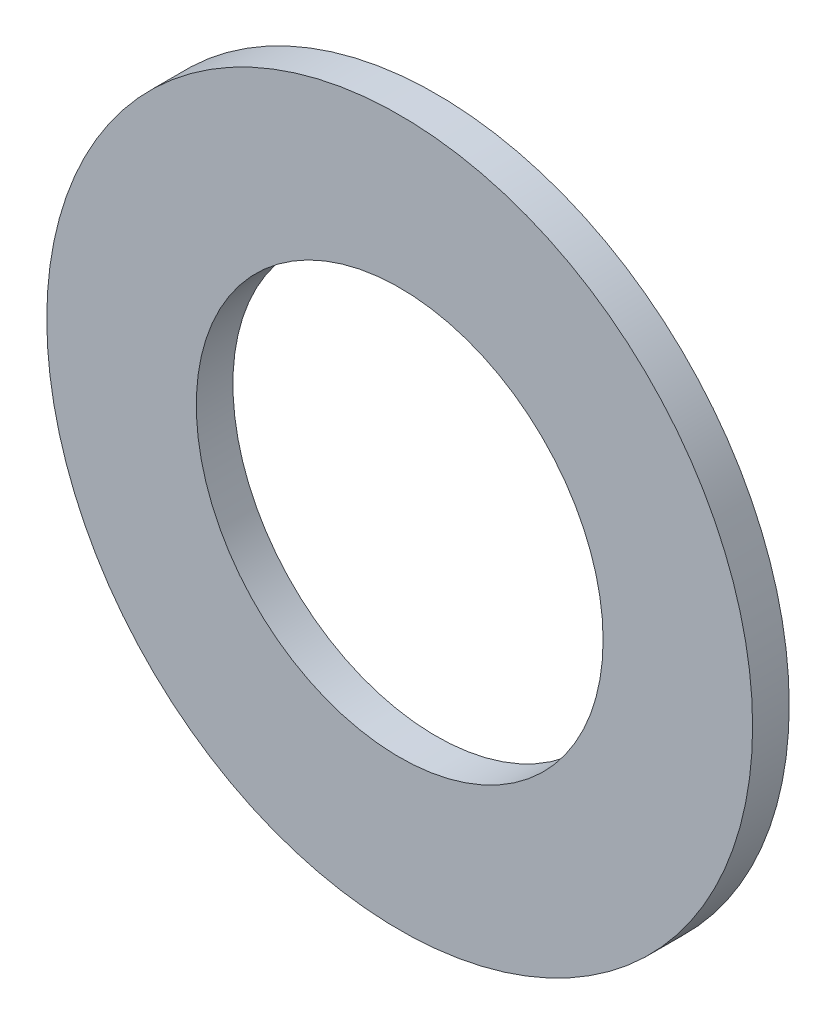
ISO-10303-21;
HEADER;
FILE_DESCRIPTION(('STEP AP214'),'2;1');
FILE_NAME('part.step','',(''),(''),'','','');
FILE_SCHEMA(('AUTOMOTIVE_DESIGN { 1 0 10303 214 1 1 1 1 }'));
ENDSEC;
DATA;
#1=APPLICATION_CONTEXT('core data for automotive mechanical design processes');
#2=APPLICATION_PROTOCOL_DEFINITION('international standard','automotive_design',2000,#1);
#3=PRODUCT_CONTEXT('',#1,'mechanical');
#4=PRODUCT('Part','Part','',(#3));
#5=PRODUCT_RELATED_PRODUCT_CATEGORY('part','',(#4));
#6=PRODUCT_DEFINITION_FORMATION('','',#4);
#7=PRODUCT_DEFINITION_CONTEXT('part definition',#1,'design');
#8=PRODUCT_DEFINITION('design','',#6,#7);
#9=PRODUCT_DEFINITION_SHAPE('','',#8);
#10=(LENGTH_UNIT() NAMED_UNIT(*) SI_UNIT(.MILLI.,.METRE.));
#11=(NAMED_UNIT(*) PLANE_ANGLE_UNIT() SI_UNIT($,.RADIAN.));
#12=(NAMED_UNIT(*) SI_UNIT($,.STERADIAN.) SOLID_ANGLE_UNIT());
#13=UNCERTAINTY_MEASURE_WITH_UNIT(LENGTH_MEASURE(1.E-05),#10,'distance_accuracy_value','');
#14=(GEOMETRIC_REPRESENTATION_CONTEXT(3) GLOBAL_UNCERTAINTY_ASSIGNED_CONTEXT((#13)) GLOBAL_UNIT_ASSIGNED_CONTEXT((#10,
#11,#12)) REPRESENTATION_CONTEXT('',''));
#15=CARTESIAN_POINT('',(0.,0.,0.));
#16=DIRECTION('',(0.,0.,1.));
#17=DIRECTION('',(1.,0.,0.));
#18=AXIS2_PLACEMENT_3D('',#15,#16,#17);
#19=CARTESIAN_POINT('',(0.,0.,1.8));
#20=DIRECTION('',(0.,0.,1.));
#21=DIRECTION('',(1.,0.,0.));
#22=AXIS2_PLACEMENT_3D('',#19,#20,#21);
#23=PLANE('',#22);
#24=CARTESIAN_POINT('',(0.,0.,1.8));
#25=DIRECTION('',(0.,0.,1.));
#26=DIRECTION('',(1.,0.,0.));
#27=AXIS2_PLACEMENT_3D('',#24,#25,#26);
#28=CIRCLE('',#27,17.35);
#29=CARTESIAN_POINT('',(17.35,0.,1.8));
#30=VERTEX_POINT('',#29);
#31=EDGE_CURVE('E10',#30,#30,#28,.T.);
#32=ORIENTED_EDGE('',*,*,#31,.T.);
#33=EDGE_LOOP('',(#32));
#34=FACE_BOUND('',#33,.T.);
#35=CARTESIAN_POINT('',(0.,0.,1.8));
#36=DIRECTION('',(0.,0.,1.));
#37=DIRECTION('',(1.,0.,0.));
#38=AXIS2_PLACEMENT_3D('',#35,#36,#37);
#39=CIRCLE('',#38,10.);
#40=CARTESIAN_POINT('',(10.,0.,1.8));
#41=VERTEX_POINT('',#40);
#42=EDGE_CURVE('E42',#41,#41,#39,.T.);
#43=ORIENTED_EDGE('',*,*,#42,.F.);
#44=EDGE_LOOP('',(#43));
#45=FACE_BOUND('',#44,.T.);
#46=ADVANCED_FACE('F31',(#34,#45),#23,.T.);
#47=CARTESIAN_POINT('',(0.,0.,0.));
#48=DIRECTION('',(0.,0.,1.));
#49=DIRECTION('',(1.,0.,0.));
#50=AXIS2_PLACEMENT_3D('',#47,#48,#49);
#51=PLANE('',#50);
#52=CARTESIAN_POINT('',(0.,0.,0.));
#53=DIRECTION('',(0.,0.,1.));
#54=DIRECTION('',(1.,0.,0.));
#55=AXIS2_PLACEMENT_3D('',#52,#53,#54);
#56=CIRCLE('',#55,17.35);
#57=CARTESIAN_POINT('',(17.35,0.,0.));
#58=VERTEX_POINT('',#57);
#59=EDGE_CURVE('E38',#58,#58,#56,.T.);
#60=ORIENTED_EDGE('',*,*,#59,.F.);
#61=EDGE_LOOP('',(#60));
#62=FACE_BOUND('',#61,.T.);
#63=CARTESIAN_POINT('',(0.,0.,0.));
#64=DIRECTION('',(0.,0.,1.));
#65=DIRECTION('',(1.,0.,0.));
#66=AXIS2_PLACEMENT_3D('',#63,#64,#65);
#67=CIRCLE('',#66,10.);
#68=CARTESIAN_POINT('',(10.,0.,0.));
#69=VERTEX_POINT('',#68);
#70=EDGE_CURVE('E46',#69,#69,#67,.T.);
#71=ORIENTED_EDGE('',*,*,#70,.T.);
#72=EDGE_LOOP('',(#71));
#73=FACE_BOUND('',#72,.T.);
#74=ADVANCED_FACE('F52',(#62,#73),#51,.F.);
#75=CARTESIAN_POINT('',(0.,0.,1.8));
#76=DIRECTION('',(0.,0.,-1.));
#77=DIRECTION('',(-1.,0.,0.));
#78=AXIS2_PLACEMENT_3D('',#75,#76,#77);
#79=CYLINDRICAL_SURFACE('',#78,17.35);
#80=ORIENTED_EDGE('',*,*,#31,.F.);
#81=EDGE_LOOP('',(#80));
#82=FACE_BOUND('',#81,.T.);
#83=ORIENTED_EDGE('',*,*,#59,.T.);
#84=EDGE_LOOP('',(#83));
#85=FACE_BOUND('',#84,.T.);
#86=ADVANCED_FACE('F33',(#82,#85),#79,.T.);
#87=CARTESIAN_POINT('',(0.,0.,1.8));
#88=DIRECTION('',(0.,0.,-1.));
#89=DIRECTION('',(-1.,0.,0.));
#90=AXIS2_PLACEMENT_3D('',#87,#88,#89);
#91=CYLINDRICAL_SURFACE('',#90,10.);
#92=ORIENTED_EDGE('',*,*,#42,.T.);
#93=EDGE_LOOP('',(#92));
#94=FACE_BOUND('',#93,.T.);
#95=ORIENTED_EDGE('',*,*,#70,.F.);
#96=EDGE_LOOP('',(#95));
#97=FACE_BOUND('',#96,.T.);
#98=ADVANCED_FACE('F54',(#94,#97),#91,.F.);
#99=CLOSED_SHELL('',(#46,#74,#86,#98));
#100=MANIFOLD_SOLID_BREP('B2',#99);
#101=ADVANCED_BREP_SHAPE_REPRESENTATION('',(#18,#100),#14);
#102=SHAPE_DEFINITION_REPRESENTATION(#9,#101);
ENDSEC;
END-ISO-10303-21;
